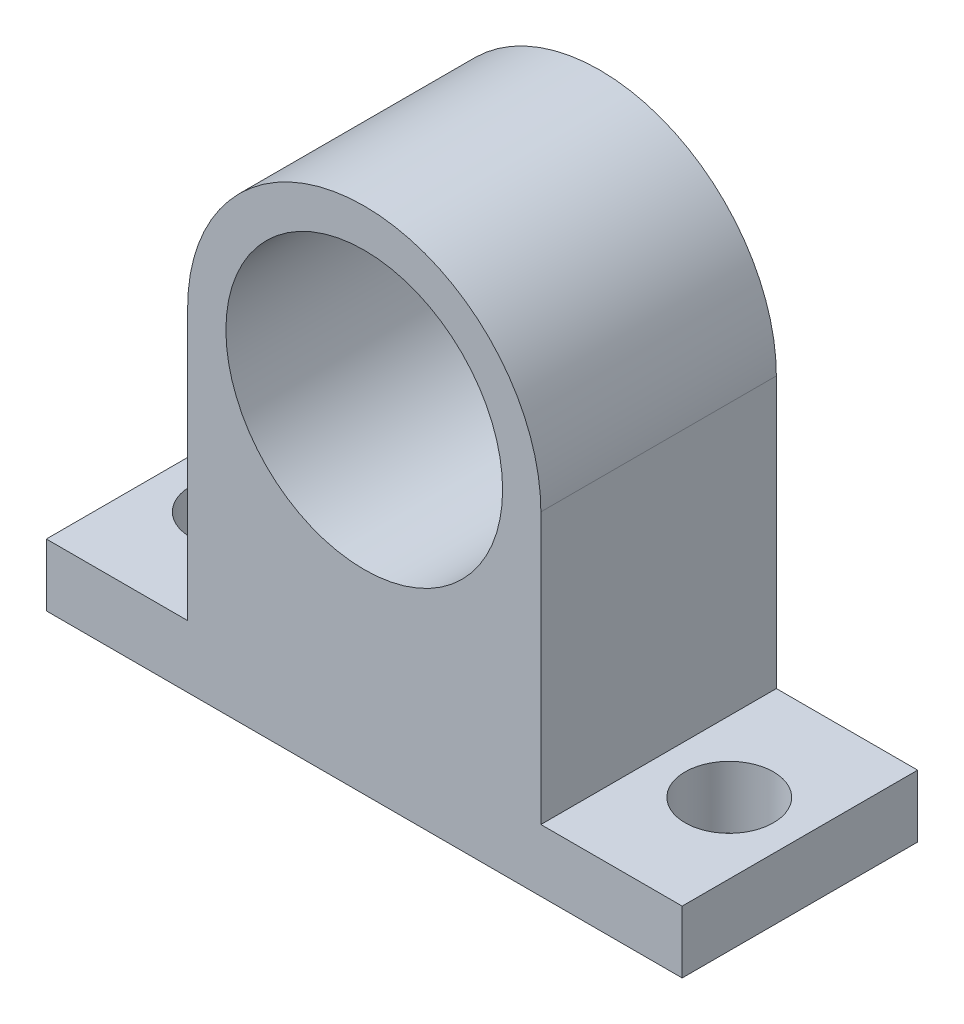
ISO-10303-21;
HEADER;
FILE_DESCRIPTION(('STEP AP214'),'2;1');
FILE_NAME('part.step','',(''),(''),'','','');
FILE_SCHEMA(('AUTOMOTIVE_DESIGN { 1 0 10303 214 1 1 1 1 }'));
ENDSEC;
DATA;
#1=APPLICATION_CONTEXT('core data for automotive mechanical design processes');
#2=APPLICATION_PROTOCOL_DEFINITION('international standard','automotive_design',2000,#1);
#3=PRODUCT_CONTEXT('',#1,'mechanical');
#4=PRODUCT('Part','Part','',(#3));
#5=PRODUCT_RELATED_PRODUCT_CATEGORY('part','',(#4));
#6=PRODUCT_DEFINITION_FORMATION('','',#4);
#7=PRODUCT_DEFINITION_CONTEXT('part definition',#1,'design');
#8=PRODUCT_DEFINITION('design','',#6,#7);
#9=PRODUCT_DEFINITION_SHAPE('','',#8);
#10=(LENGTH_UNIT() NAMED_UNIT(*) SI_UNIT(.MILLI.,.METRE.));
#11=(NAMED_UNIT(*) PLANE_ANGLE_UNIT() SI_UNIT($,.RADIAN.));
#12=(NAMED_UNIT(*) SI_UNIT($,.STERADIAN.) SOLID_ANGLE_UNIT());
#13=UNCERTAINTY_MEASURE_WITH_UNIT(LENGTH_MEASURE(1.E-05),#10,'distance_accuracy_value','');
#14=(GEOMETRIC_REPRESENTATION_CONTEXT(3) GLOBAL_UNCERTAINTY_ASSIGNED_CONTEXT((#13)) GLOBAL_UNIT_ASSIGNED_CONTEXT((#10,
#11,#12)) REPRESENTATION_CONTEXT('',''));
#15=CARTESIAN_POINT('',(0.,0.,0.));
#16=DIRECTION('',(0.,0.,1.));
#17=DIRECTION('',(1.,0.,0.));
#18=AXIS2_PLACEMENT_3D('',#15,#16,#17);
#19=CARTESIAN_POINT('',(0.,0.,40.));
#20=DIRECTION('',(0.,0.,1.));
#21=DIRECTION('',(1.,0.,0.));
#22=AXIS2_PLACEMENT_3D('',#19,#20,#21);
#23=PLANE('',#22);
#24=CARTESIAN_POINT('',(0.,0.,40.));
#25=DIRECTION('',(0.,0.,1.));
#26=DIRECTION('',(1.,0.,0.));
#27=AXIS2_PLACEMENT_3D('',#24,#25,#26);
#28=CIRCLE('',#27,30.);
#29=CARTESIAN_POINT('',(30.,0.,40.));
#30=VERTEX_POINT('',#29);
#31=CARTESIAN_POINT('',(-30.,0.,40.));
#32=VERTEX_POINT('',#31);
#33=EDGE_CURVE('E167',#30,#32,#28,.T.);
#34=ORIENTED_EDGE('',*,*,#33,.T.);
#35=DIRECTION('',(0.,-1.,0.));
#36=VECTOR('',#35,1.);
#37=CARTESIAN_POINT('',(-30.,0.,40.));
#38=LINE('',#37,#36);
#39=CARTESIAN_POINT('',(-30.,-45.9915962639265,40.));
#40=VERTEX_POINT('',#39);
#41=EDGE_CURVE('E103',#32,#40,#38,.T.);
#42=ORIENTED_EDGE('',*,*,#41,.T.);
#43=DIRECTION('',(-1.,0.,0.));
#44=VECTOR('',#43,1.);
#45=CARTESIAN_POINT('',(-30.,-45.9915962639265,40.));
#46=LINE('',#45,#44);
#47=CARTESIAN_POINT('',(-54.,-45.9915962639265,40.));
#48=VERTEX_POINT('',#47);
#49=EDGE_CURVE('E189',#40,#48,#46,.T.);
#50=ORIENTED_EDGE('',*,*,#49,.T.);
#51=DIRECTION('',(0.,-1.,0.));
#52=VECTOR('',#51,1.);
#53=CARTESIAN_POINT('',(-54.,-45.9915962639265,40.));
#54=LINE('',#53,#52);
#55=CARTESIAN_POINT('',(-54.,-56.5687449754537,40.));
#56=VERTEX_POINT('',#55);
#57=EDGE_CURVE('E203',#48,#56,#54,.T.);
#58=ORIENTED_EDGE('',*,*,#57,.T.);
#59=DIRECTION('',(1.,0.,0.));
#60=VECTOR('',#59,1.);
#61=CARTESIAN_POINT('',(-54.,-56.5687449754537,40.));
#62=LINE('',#61,#60);
#63=CARTESIAN_POINT('',(54.,-56.5687449754537,40.));
#64=VERTEX_POINT('',#63);
#65=EDGE_CURVE('E122',#56,#64,#62,.T.);
#66=ORIENTED_EDGE('',*,*,#65,.T.);
#67=DIRECTION('',(0.,1.,0.));
#68=VECTOR('',#67,1.);
#69=CARTESIAN_POINT('',(54.,-56.5687449754537,40.));
#70=LINE('',#69,#68);
#71=CARTESIAN_POINT('',(54.,-45.9915962639265,40.));
#72=VERTEX_POINT('',#71);
#73=EDGE_CURVE('E116',#64,#72,#70,.T.);
#74=ORIENTED_EDGE('',*,*,#73,.T.);
#75=DIRECTION('',(-1.,0.,0.));
#76=VECTOR('',#75,1.);
#77=CARTESIAN_POINT('',(54.,-45.9915962639265,40.));
#78=LINE('',#77,#76);
#79=CARTESIAN_POINT('',(30.,-45.9915962639265,40.));
#80=VERTEX_POINT('',#79);
#81=EDGE_CURVE('E120',#72,#80,#78,.T.);
#82=ORIENTED_EDGE('',*,*,#81,.T.);
#83=DIRECTION('',(0.,1.,0.));
#84=VECTOR('',#83,1.);
#85=CARTESIAN_POINT('',(30.,0.,40.));
#86=LINE('',#85,#84);
#87=EDGE_CURVE('E60',#80,#30,#86,.T.);
#88=ORIENTED_EDGE('',*,*,#87,.T.);
#89=EDGE_LOOP('',(#34,#42,#50,#58,#66,#74,#82,#88));
#90=FACE_BOUND('',#89,.T.);
#91=CARTESIAN_POINT('',(0.,0.,40.));
#92=DIRECTION('',(0.,0.,1.));
#93=DIRECTION('',(1.,0.,0.));
#94=AXIS2_PLACEMENT_3D('',#91,#92,#93);
#95=CIRCLE('',#94,23.5);
#96=CARTESIAN_POINT('',(23.5,0.,40.));
#97=VERTEX_POINT('',#96);
#98=EDGE_CURVE('E149',#97,#97,#95,.T.);
#99=ORIENTED_EDGE('',*,*,#98,.F.);
#100=EDGE_LOOP('',(#99));
#101=FACE_BOUND('',#100,.T.);
#102=ADVANCED_FACE('F41',(#90,#101),#23,.T.);
#103=CARTESIAN_POINT('',(0.,0.,0.));
#104=DIRECTION('',(0.,0.,1.));
#105=DIRECTION('',(1.,0.,0.));
#106=AXIS2_PLACEMENT_3D('',#103,#104,#105);
#107=PLANE('',#106);
#108=CARTESIAN_POINT('',(0.,0.,0.));
#109=DIRECTION('',(0.,0.,1.));
#110=DIRECTION('',(1.,0.,0.));
#111=AXIS2_PLACEMENT_3D('',#108,#109,#110);
#112=CIRCLE('',#111,30.);
#113=CARTESIAN_POINT('',(30.,0.,0.));
#114=VERTEX_POINT('',#113);
#115=CARTESIAN_POINT('',(-30.,0.,0.));
#116=VERTEX_POINT('',#115);
#117=EDGE_CURVE('E144',#114,#116,#112,.T.);
#118=ORIENTED_EDGE('',*,*,#117,.F.);
#119=DIRECTION('',(0.,1.,0.));
#120=VECTOR('',#119,1.);
#121=CARTESIAN_POINT('',(30.,0.,0.));
#122=LINE('',#121,#120);
#123=CARTESIAN_POINT('',(30.,-45.9915962639265,0.));
#124=VERTEX_POINT('',#123);
#125=EDGE_CURVE('E95',#124,#114,#122,.T.);
#126=ORIENTED_EDGE('',*,*,#125,.F.);
#127=DIRECTION('',(-1.,0.,0.));
#128=VECTOR('',#127,1.);
#129=CARTESIAN_POINT('',(54.,-45.9915962639265,0.));
#130=LINE('',#129,#128);
#131=CARTESIAN_POINT('',(54.,-45.9915962639265,0.));
#132=VERTEX_POINT('',#131);
#133=EDGE_CURVE('E89',#132,#124,#130,.T.);
#134=ORIENTED_EDGE('',*,*,#133,.F.);
#135=DIRECTION('',(0.,1.,0.));
#136=VECTOR('',#135,1.);
#137=CARTESIAN_POINT('',(54.,-56.5687449754537,0.));
#138=LINE('',#137,#136);
#139=CARTESIAN_POINT('',(54.,-56.5687449754537,0.));
#140=VERTEX_POINT('',#139);
#141=EDGE_CURVE('E131',#140,#132,#138,.T.);
#142=ORIENTED_EDGE('',*,*,#141,.F.);
#143=DIRECTION('',(1.,0.,0.));
#144=VECTOR('',#143,1.);
#145=CARTESIAN_POINT('',(-54.,-56.5687449754537,0.));
#146=LINE('',#145,#144);
#147=CARTESIAN_POINT('',(-54.,-56.5687449754537,0.));
#148=VERTEX_POINT('',#147);
#149=EDGE_CURVE('E158',#148,#140,#146,.T.);
#150=ORIENTED_EDGE('',*,*,#149,.F.);
#151=DIRECTION('',(0.,-1.,0.));
#152=VECTOR('',#151,1.);
#153=CARTESIAN_POINT('',(-54.,-45.9915962639265,0.));
#154=LINE('',#153,#152);
#155=CARTESIAN_POINT('',(-54.,-45.9915962639265,0.));
#156=VERTEX_POINT('',#155);
#157=EDGE_CURVE('E155',#156,#148,#154,.T.);
#158=ORIENTED_EDGE('',*,*,#157,.F.);
#159=DIRECTION('',(-1.,0.,0.));
#160=VECTOR('',#159,1.);
#161=CARTESIAN_POINT('',(-30.,-45.9915962639265,0.));
#162=LINE('',#161,#160);
#163=CARTESIAN_POINT('',(-30.,-45.9915962639265,0.));
#164=VERTEX_POINT('',#163);
#165=EDGE_CURVE('E152',#164,#156,#162,.T.);
#166=ORIENTED_EDGE('',*,*,#165,.F.);
#167=DIRECTION('',(0.,-1.,0.));
#168=VECTOR('',#167,1.);
#169=CARTESIAN_POINT('',(-30.,0.,0.));
#170=LINE('',#169,#168);
#171=EDGE_CURVE('E148',#116,#164,#170,.T.);
#172=ORIENTED_EDGE('',*,*,#171,.F.);
#173=EDGE_LOOP('',(#118,#126,#134,#142,#150,#158,#166,#172));
#174=FACE_BOUND('',#173,.T.);
#175=CARTESIAN_POINT('',(0.,0.,0.));
#176=DIRECTION('',(0.,0.,1.));
#177=DIRECTION('',(1.,0.,0.));
#178=AXIS2_PLACEMENT_3D('',#175,#176,#177);
#179=CIRCLE('',#178,23.5);
#180=CARTESIAN_POINT('',(23.5,0.,0.));
#181=VERTEX_POINT('',#180);
#182=EDGE_CURVE('E213',#181,#181,#179,.T.);
#183=ORIENTED_EDGE('',*,*,#182,.T.);
#184=EDGE_LOOP('',(#183));
#185=FACE_BOUND('',#184,.T.);
#186=ADVANCED_FACE('F193',(#174,#185),#107,.F.);
#187=CARTESIAN_POINT('',(0.,0.,40.));
#188=DIRECTION('',(0.,0.,-1.));
#189=DIRECTION('',(-1.,0.,0.));
#190=AXIS2_PLACEMENT_3D('',#187,#188,#189);
#191=CYLINDRICAL_SURFACE('',#190,30.);
#192=ORIENTED_EDGE('',*,*,#117,.T.);
#193=DIRECTION('',(0.,0.,-1.));
#194=VECTOR('',#193,1.);
#195=CARTESIAN_POINT('',(-30.,0.,40.));
#196=LINE('',#195,#194);
#197=EDGE_CURVE('E11',#32,#116,#196,.T.);
#198=ORIENTED_EDGE('',*,*,#197,.F.);
#199=ORIENTED_EDGE('',*,*,#33,.F.);
#200=DIRECTION('',(0.,0.,-1.));
#201=VECTOR('',#200,1.);
#202=CARTESIAN_POINT('',(30.,0.,40.));
#203=LINE('',#202,#201);
#204=EDGE_CURVE('E140',#30,#114,#203,.T.);
#205=ORIENTED_EDGE('',*,*,#204,.T.);
#206=EDGE_LOOP('',(#192,#198,#199,#205));
#207=FACE_BOUND('',#206,.T.);
#208=ADVANCED_FACE('F43',(#207),#191,.T.);
#209=CARTESIAN_POINT('',(-30.,0.,40.));
#210=DIRECTION('',(1.,0.,0.));
#211=DIRECTION('',(0.,0.,-1.));
#212=AXIS2_PLACEMENT_3D('',#209,#210,#211);
#213=PLANE('',#212);
#214=ORIENTED_EDGE('',*,*,#171,.T.);
#215=DIRECTION('',(0.,0.,-1.));
#216=VECTOR('',#215,1.);
#217=CARTESIAN_POINT('',(-30.,-45.9915962639265,40.));
#218=LINE('',#217,#216);
#219=EDGE_CURVE('E52',#40,#164,#218,.T.);
#220=ORIENTED_EDGE('',*,*,#219,.F.);
#221=ORIENTED_EDGE('',*,*,#41,.F.);
#222=ORIENTED_EDGE('',*,*,#197,.T.);
#223=EDGE_LOOP('',(#214,#220,#221,#222));
#224=FACE_BOUND('',#223,.T.);
#225=ADVANCED_FACE('F271',(#224),#213,.F.);
#226=CARTESIAN_POINT('',(-30.,-45.9915962639265,40.));
#227=DIRECTION('',(0.,-1.,0.));
#228=DIRECTION('',(0.,0.,-1.));
#229=AXIS2_PLACEMENT_3D('',#226,#227,#228);
#230=PLANE('',#229);
#231=CARTESIAN_POINT('',(-42.,-45.9915962639265,20.));
#232=DIRECTION('',(0.,-1.,0.));
#233=DIRECTION('',(0.,0.,-1.));
#234=AXIS2_PLACEMENT_3D('',#231,#232,#233);
#235=CIRCLE('',#234,7.5);
#236=CARTESIAN_POINT('',(-42.,-45.9915962639265,12.5));
#237=VERTEX_POINT('',#236);
#238=EDGE_CURVE('E217',#237,#237,#235,.T.);
#239=ORIENTED_EDGE('',*,*,#238,.T.);
#240=EDGE_LOOP('',(#239));
#241=FACE_BOUND('',#240,.T.);
#242=ORIENTED_EDGE('',*,*,#165,.T.);
#243=DIRECTION('',(0.,0.,-1.));
#244=VECTOR('',#243,1.);
#245=CARTESIAN_POINT('',(-54.,-45.9915962639265,40.));
#246=LINE('',#245,#244);
#247=EDGE_CURVE('E178',#48,#156,#246,.T.);
#248=ORIENTED_EDGE('',*,*,#247,.F.);
#249=ORIENTED_EDGE('',*,*,#49,.F.);
#250=ORIENTED_EDGE('',*,*,#219,.T.);
#251=EDGE_LOOP('',(#242,#248,#249,#250));
#252=FACE_BOUND('',#251,.T.);
#253=ADVANCED_FACE('F187',(#241,#252),#230,.F.);
#254=CARTESIAN_POINT('',(-54.,-45.9915962639265,40.));
#255=DIRECTION('',(1.,0.,0.));
#256=DIRECTION('',(0.,0.,-1.));
#257=AXIS2_PLACEMENT_3D('',#254,#255,#256);
#258=PLANE('',#257);
#259=ORIENTED_EDGE('',*,*,#157,.T.);
#260=DIRECTION('',(0.,0.,-1.));
#261=VECTOR('',#260,1.);
#262=CARTESIAN_POINT('',(-54.,-56.5687449754537,40.));
#263=LINE('',#262,#261);
#264=EDGE_CURVE('E174',#56,#148,#263,.T.);
#265=ORIENTED_EDGE('',*,*,#264,.F.);
#266=ORIENTED_EDGE('',*,*,#57,.F.);
#267=ORIENTED_EDGE('',*,*,#247,.T.);
#268=EDGE_LOOP('',(#259,#265,#266,#267));
#269=FACE_BOUND('',#268,.T.);
#270=ADVANCED_FACE('F198',(#269),#258,.F.);
#271=CARTESIAN_POINT('',(-54.,-56.5687449754537,40.));
#272=DIRECTION('',(0.,1.,0.));
#273=DIRECTION('',(-1.,0.,0.));
#274=AXIS2_PLACEMENT_3D('',#271,#272,#273);
#275=PLANE('',#274);
#276=CARTESIAN_POINT('',(42.,-56.5687449754537,20.));
#277=DIRECTION('',(0.,1.,0.));
#278=DIRECTION('',(-1.,0.,0.));
#279=AXIS2_PLACEMENT_3D('',#276,#277,#278);
#280=CIRCLE('',#279,7.5);
#281=CARTESIAN_POINT('',(34.5,-56.5687449754537,20.));
#282=VERTEX_POINT('',#281);
#283=EDGE_CURVE('E228',#282,#282,#280,.T.);
#284=ORIENTED_EDGE('',*,*,#283,.T.);
#285=EDGE_LOOP('',(#284));
#286=FACE_BOUND('',#285,.T.);
#287=CARTESIAN_POINT('',(-42.,-56.5687449754537,20.));
#288=DIRECTION('',(0.,1.,0.));
#289=DIRECTION('',(1.,0.,0.));
#290=AXIS2_PLACEMENT_3D('',#287,#288,#289);
#291=CIRCLE('',#290,7.5);
#292=CARTESIAN_POINT('',(-34.5,-56.5687449754537,20.));
#293=VERTEX_POINT('',#292);
#294=EDGE_CURVE('E224',#293,#293,#291,.T.);
#295=ORIENTED_EDGE('',*,*,#294,.T.);
#296=EDGE_LOOP('',(#295));
#297=FACE_BOUND('',#296,.T.);
#298=ORIENTED_EDGE('',*,*,#149,.T.);
#299=DIRECTION('',(0.,0.,-1.));
#300=VECTOR('',#299,1.);
#301=CARTESIAN_POINT('',(54.,-56.5687449754537,40.));
#302=LINE('',#301,#300);
#303=EDGE_CURVE('E133',#64,#140,#302,.T.);
#304=ORIENTED_EDGE('',*,*,#303,.F.);
#305=ORIENTED_EDGE('',*,*,#65,.F.);
#306=ORIENTED_EDGE('',*,*,#264,.T.);
#307=EDGE_LOOP('',(#298,#304,#305,#306));
#308=FACE_BOUND('',#307,.T.);
#309=ADVANCED_FACE('F201',(#286,#297,#308),#275,.F.);
#310=CARTESIAN_POINT('',(54.,-56.5687449754537,40.));
#311=DIRECTION('',(-1.,0.,0.));
#312=DIRECTION('',(0.,-1.,0.));
#313=AXIS2_PLACEMENT_3D('',#310,#311,#312);
#314=PLANE('',#313);
#315=ORIENTED_EDGE('',*,*,#141,.T.);
#316=DIRECTION('',(0.,0.,-1.));
#317=VECTOR('',#316,1.);
#318=CARTESIAN_POINT('',(54.,-45.9915962639265,40.));
#319=LINE('',#318,#317);
#320=EDGE_CURVE('E128',#72,#132,#319,.T.);
#321=ORIENTED_EDGE('',*,*,#320,.F.);
#322=ORIENTED_EDGE('',*,*,#73,.F.);
#323=ORIENTED_EDGE('',*,*,#303,.T.);
#324=EDGE_LOOP('',(#315,#321,#322,#323));
#325=FACE_BOUND('',#324,.T.);
#326=ADVANCED_FACE('F129',(#325),#314,.F.);
#327=CARTESIAN_POINT('',(54.,-45.9915962639265,40.));
#328=DIRECTION('',(0.,-1.,0.));
#329=DIRECTION('',(0.,0.,-1.));
#330=AXIS2_PLACEMENT_3D('',#327,#328,#329);
#331=PLANE('',#330);
#332=CARTESIAN_POINT('',(42.,-45.9915962639265,20.));
#333=DIRECTION('',(0.,-1.,0.));
#334=DIRECTION('',(0.,0.,-1.));
#335=AXIS2_PLACEMENT_3D('',#332,#333,#334);
#336=CIRCLE('',#335,7.5);
#337=CARTESIAN_POINT('',(42.,-45.9915962639265,12.5));
#338=VERTEX_POINT('',#337);
#339=EDGE_CURVE('E45',#338,#338,#336,.T.);
#340=ORIENTED_EDGE('',*,*,#339,.T.);
#341=EDGE_LOOP('',(#340));
#342=FACE_BOUND('',#341,.T.);
#343=ORIENTED_EDGE('',*,*,#133,.T.);
#344=DIRECTION('',(0.,0.,-1.));
#345=VECTOR('',#344,1.);
#346=CARTESIAN_POINT('',(30.,-45.9915962639265,40.));
#347=LINE('',#346,#345);
#348=EDGE_CURVE('E134',#80,#124,#347,.T.);
#349=ORIENTED_EDGE('',*,*,#348,.F.);
#350=ORIENTED_EDGE('',*,*,#81,.F.);
#351=ORIENTED_EDGE('',*,*,#320,.T.);
#352=EDGE_LOOP('',(#343,#349,#350,#351));
#353=FACE_BOUND('',#352,.T.);
#354=ADVANCED_FACE('F136',(#342,#353),#331,.F.);
#355=CARTESIAN_POINT('',(30.,0.,40.));
#356=DIRECTION('',(-1.,0.,0.));
#357=DIRECTION('',(0.,0.,1.));
#358=AXIS2_PLACEMENT_3D('',#355,#356,#357);
#359=PLANE('',#358);
#360=ORIENTED_EDGE('',*,*,#125,.T.);
#361=ORIENTED_EDGE('',*,*,#204,.F.);
#362=ORIENTED_EDGE('',*,*,#87,.F.);
#363=ORIENTED_EDGE('',*,*,#348,.T.);
#364=EDGE_LOOP('',(#360,#361,#362,#363));
#365=FACE_BOUND('',#364,.T.);
#366=ADVANCED_FACE('F250',(#365),#359,.F.);
#367=CARTESIAN_POINT('',(0.,0.,40.));
#368=DIRECTION('',(0.,0.,-1.));
#369=DIRECTION('',(-1.,0.,0.));
#370=AXIS2_PLACEMENT_3D('',#367,#368,#369);
#371=CYLINDRICAL_SURFACE('',#370,23.5);
#372=ORIENTED_EDGE('',*,*,#98,.T.);
#373=EDGE_LOOP('',(#372));
#374=FACE_BOUND('',#373,.T.);
#375=ORIENTED_EDGE('',*,*,#182,.F.);
#376=EDGE_LOOP('',(#375));
#377=FACE_BOUND('',#376,.T.);
#378=ADVANCED_FACE('F241',(#374,#377),#371,.F.);
#379=CARTESIAN_POINT('',(42.,-56.5687449754537,20.));
#380=DIRECTION('',(0.,1.,0.));
#381=DIRECTION('',(-1.,0.,0.));
#382=AXIS2_PLACEMENT_3D('',#379,#380,#381);
#383=CYLINDRICAL_SURFACE('',#382,7.5);
#384=ORIENTED_EDGE('',*,*,#283,.F.);
#385=EDGE_LOOP('',(#384));
#386=FACE_BOUND('',#385,.T.);
#387=ORIENTED_EDGE('',*,*,#339,.F.);
#388=EDGE_LOOP('',(#387));
#389=FACE_BOUND('',#388,.T.);
#390=ADVANCED_FACE('F238',(#386,#389),#383,.F.);
#391=CARTESIAN_POINT('',(-42.,-56.5687449754537,20.));
#392=DIRECTION('',(0.,1.,0.));
#393=DIRECTION('',(-1.,0.,0.));
#394=AXIS2_PLACEMENT_3D('',#391,#392,#393);
#395=CYLINDRICAL_SURFACE('',#394,7.5);
#396=ORIENTED_EDGE('',*,*,#294,.F.);
#397=EDGE_LOOP('',(#396));
#398=FACE_BOUND('',#397,.T.);
#399=ORIENTED_EDGE('',*,*,#238,.F.);
#400=EDGE_LOOP('',(#399));
#401=FACE_BOUND('',#400,.T.);
#402=ADVANCED_FACE('F240',(#398,#401),#395,.F.);
#403=CLOSED_SHELL('',(#102,#186,#208,#225,#253,#270,#309,#326,#354,#366,#378,#390,#402));
#404=MANIFOLD_SOLID_BREP('B2',#403);
#405=ADVANCED_BREP_SHAPE_REPRESENTATION('',(#18,#404),#14);
#406=SHAPE_DEFINITION_REPRESENTATION(#9,#405);
ENDSEC;
END-ISO-10303-21;
